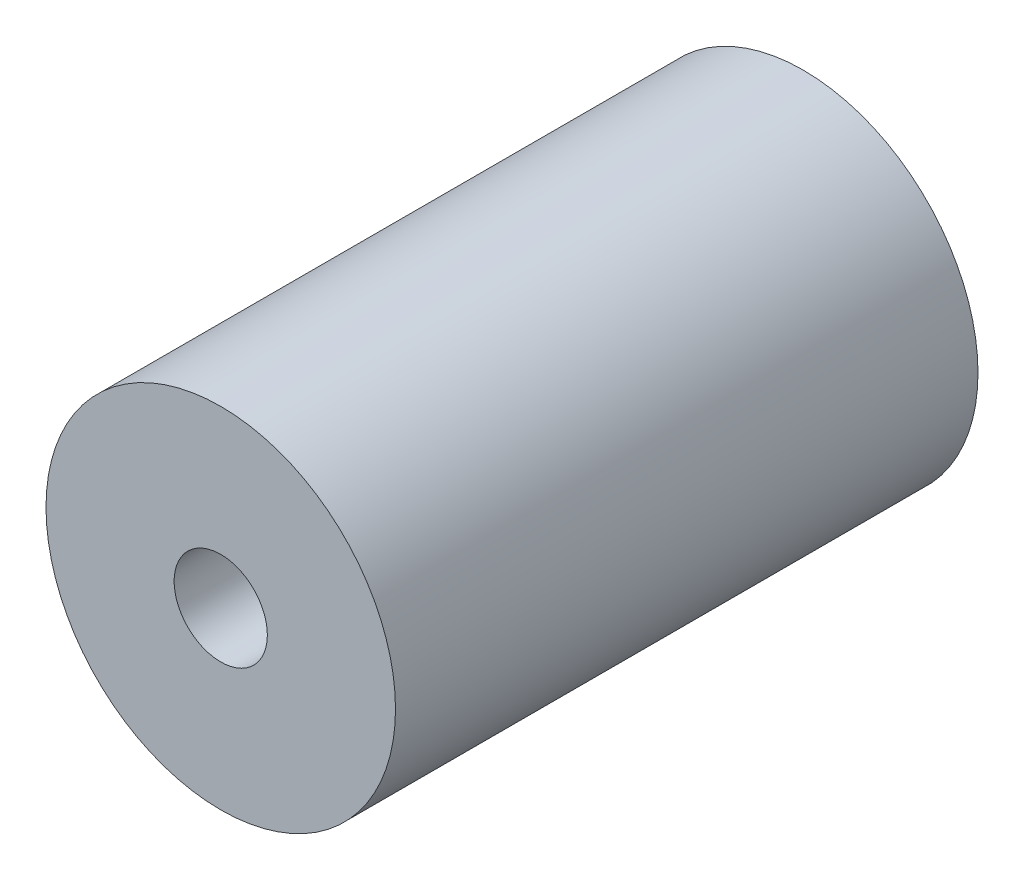
ISO-10303-21;
HEADER;
FILE_DESCRIPTION(('STEP AP214'),'2;1');
FILE_NAME('part.step','',(''),(''),'','','');
FILE_SCHEMA(('AUTOMOTIVE_DESIGN { 1 0 10303 214 1 1 1 1 }'));
ENDSEC;
DATA;
#1=APPLICATION_CONTEXT('core data for automotive mechanical design processes');
#2=APPLICATION_PROTOCOL_DEFINITION('international standard','automotive_design',2000,#1);
#3=PRODUCT_CONTEXT('',#1,'mechanical');
#4=PRODUCT('Part','Part','',(#3));
#5=PRODUCT_RELATED_PRODUCT_CATEGORY('part','',(#4));
#6=PRODUCT_DEFINITION_FORMATION('','',#4);
#7=PRODUCT_DEFINITION_CONTEXT('part definition',#1,'design');
#8=PRODUCT_DEFINITION('design','',#6,#7);
#9=PRODUCT_DEFINITION_SHAPE('','',#8);
#10=(LENGTH_UNIT() NAMED_UNIT(*) SI_UNIT(.MILLI.,.METRE.));
#11=(NAMED_UNIT(*) PLANE_ANGLE_UNIT() SI_UNIT($,.RADIAN.));
#12=(NAMED_UNIT(*) SI_UNIT($,.STERADIAN.) SOLID_ANGLE_UNIT());
#13=UNCERTAINTY_MEASURE_WITH_UNIT(LENGTH_MEASURE(1.E-05),#10,'distance_accuracy_value','');
#14=(GEOMETRIC_REPRESENTATION_CONTEXT(3) GLOBAL_UNCERTAINTY_ASSIGNED_CONTEXT((#13)) GLOBAL_UNIT_ASSIGNED_CONTEXT((#10,
#11,#12)) REPRESENTATION_CONTEXT('',''));
#15=CARTESIAN_POINT('',(0.,0.,0.));
#16=DIRECTION('',(0.,0.,1.));
#17=DIRECTION('',(1.,0.,0.));
#18=AXIS2_PLACEMENT_3D('',#15,#16,#17);
#19=CARTESIAN_POINT('',(0.,0.,10.));
#20=DIRECTION('',(0.,0.,1.));
#21=DIRECTION('',(1.,0.,0.));
#22=AXIS2_PLACEMENT_3D('',#19,#20,#21);
#23=PLANE('',#22);
#24=CARTESIAN_POINT('',(0.,0.,10.));
#25=DIRECTION('',(0.,0.,1.));
#26=DIRECTION('',(1.,0.,0.));
#27=AXIS2_PLACEMENT_3D('',#24,#25,#26);
#28=CIRCLE('',#27,3.);
#29=CARTESIAN_POINT('',(3.,0.,10.));
#30=VERTEX_POINT('',#29);
#31=EDGE_CURVE('E10',#30,#30,#28,.T.);
#32=ORIENTED_EDGE('',*,*,#31,.T.);
#33=EDGE_LOOP('',(#32));
#34=FACE_BOUND('',#33,.T.);
#35=CARTESIAN_POINT('',(0.,0.,10.));
#36=DIRECTION('',(0.,0.,1.));
#37=DIRECTION('',(1.,0.,0.));
#38=AXIS2_PLACEMENT_3D('',#35,#36,#37);
#39=CIRCLE('',#38,0.8);
#40=CARTESIAN_POINT('',(0.8,0.,10.));
#41=VERTEX_POINT('',#40);
#42=EDGE_CURVE('E42',#41,#41,#39,.T.);
#43=ORIENTED_EDGE('',*,*,#42,.F.);
#44=EDGE_LOOP('',(#43));
#45=FACE_BOUND('',#44,.T.);
#46=ADVANCED_FACE('F31',(#34,#45),#23,.T.);
#47=CARTESIAN_POINT('',(0.,0.,0.));
#48=DIRECTION('',(0.,0.,1.));
#49=DIRECTION('',(1.,0.,0.));
#50=AXIS2_PLACEMENT_3D('',#47,#48,#49);
#51=PLANE('',#50);
#52=CARTESIAN_POINT('',(0.,0.,0.));
#53=DIRECTION('',(0.,0.,1.));
#54=DIRECTION('',(1.,0.,0.));
#55=AXIS2_PLACEMENT_3D('',#52,#53,#54);
#56=CIRCLE('',#55,3.);
#57=CARTESIAN_POINT('',(3.,0.,0.));
#58=VERTEX_POINT('',#57);
#59=EDGE_CURVE('E35',#58,#58,#56,.T.);
#60=ORIENTED_EDGE('',*,*,#59,.F.);
#61=EDGE_LOOP('',(#60));
#62=FACE_BOUND('',#61,.T.);
#63=CARTESIAN_POINT('',(0.,0.,0.));
#64=DIRECTION('',(0.,0.,1.));
#65=DIRECTION('',(1.,0.,0.));
#66=AXIS2_PLACEMENT_3D('',#63,#64,#65);
#67=CIRCLE('',#66,0.8);
#68=CARTESIAN_POINT('',(0.8,0.,0.));
#69=VERTEX_POINT('',#68);
#70=EDGE_CURVE('E44',#69,#69,#67,.T.);
#71=ORIENTED_EDGE('',*,*,#70,.T.);
#72=EDGE_LOOP('',(#71));
#73=FACE_BOUND('',#72,.T.);
#74=ADVANCED_FACE('F54',(#62,#73),#51,.F.);
#75=CARTESIAN_POINT('',(0.,0.,10.));
#76=DIRECTION('',(0.,0.,-1.));
#77=DIRECTION('',(-1.,0.,0.));
#78=AXIS2_PLACEMENT_3D('',#75,#76,#77);
#79=CYLINDRICAL_SURFACE('',#78,3.);
#80=ORIENTED_EDGE('',*,*,#31,.F.);
#81=EDGE_LOOP('',(#80));
#82=FACE_BOUND('',#81,.T.);
#83=ORIENTED_EDGE('',*,*,#59,.T.);
#84=EDGE_LOOP('',(#83));
#85=FACE_BOUND('',#84,.T.);
#86=ADVANCED_FACE('F33',(#82,#85),#79,.T.);
#87=CARTESIAN_POINT('',(0.,0.,10.));
#88=DIRECTION('',(0.,0.,-1.));
#89=DIRECTION('',(-1.,0.,0.));
#90=AXIS2_PLACEMENT_3D('',#87,#88,#89);
#91=CYLINDRICAL_SURFACE('',#90,0.8);
#92=ORIENTED_EDGE('',*,*,#42,.T.);
#93=EDGE_LOOP('',(#92));
#94=FACE_BOUND('',#93,.T.);
#95=ORIENTED_EDGE('',*,*,#70,.F.);
#96=EDGE_LOOP('',(#95));
#97=FACE_BOUND('',#96,.T.);
#98=ADVANCED_FACE('F50',(#94,#97),#91,.F.);
#99=CLOSED_SHELL('',(#46,#74,#86,#98));
#100=MANIFOLD_SOLID_BREP('B2',#99);
#101=ADVANCED_BREP_SHAPE_REPRESENTATION('',(#18,#100),#14);
#102=SHAPE_DEFINITION_REPRESENTATION(#9,#101);
ENDSEC;
END-ISO-10303-21;
